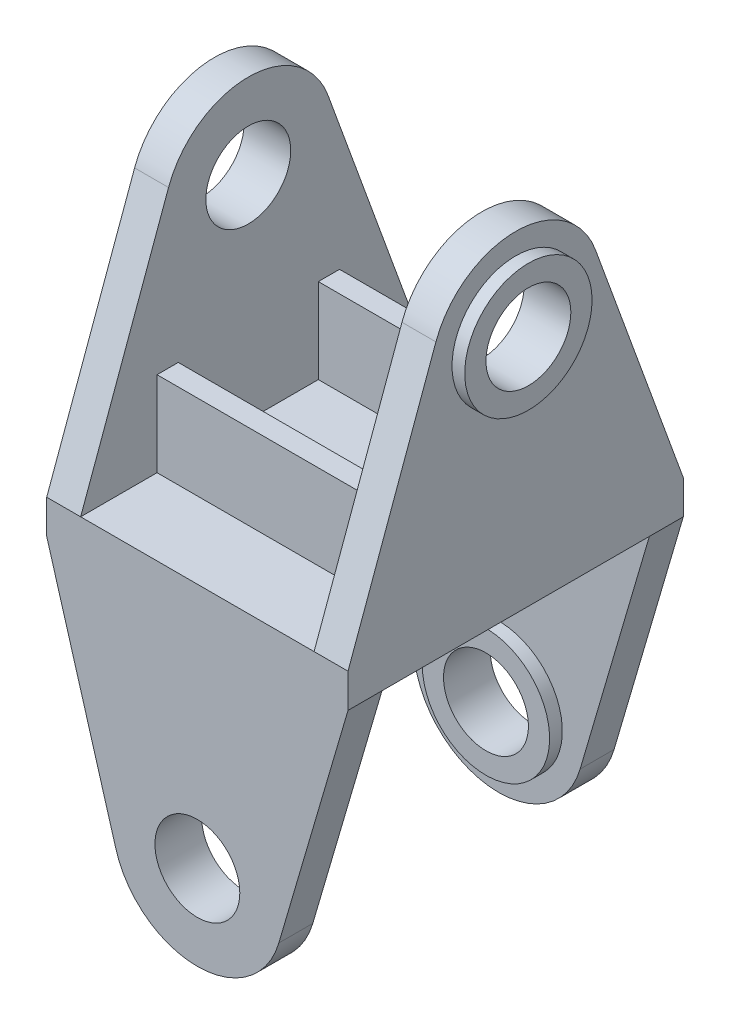
ISO-10303-21;
HEADER;
FILE_DESCRIPTION(('STEP AP214'),'2;1');
FILE_NAME('part.step','',(''),(''),'','','');
FILE_SCHEMA(('AUTOMOTIVE_DESIGN { 1 0 10303 214 1 1 1 1 }'));
ENDSEC;
DATA;
#1=APPLICATION_CONTEXT('core data for automotive mechanical design processes');
#2=APPLICATION_PROTOCOL_DEFINITION('international standard','automotive_design',2000,#1);
#3=PRODUCT_CONTEXT('',#1,'mechanical');
#4=PRODUCT('Part','Part','',(#3));
#5=PRODUCT_RELATED_PRODUCT_CATEGORY('part','',(#4));
#6=PRODUCT_DEFINITION_FORMATION('','',#4);
#7=PRODUCT_DEFINITION_CONTEXT('part definition',#1,'design');
#8=PRODUCT_DEFINITION('design','',#6,#7);
#9=PRODUCT_DEFINITION_SHAPE('','',#8);
#10=(LENGTH_UNIT() NAMED_UNIT(*) SI_UNIT(.MILLI.,.METRE.));
#11=(NAMED_UNIT(*) PLANE_ANGLE_UNIT() SI_UNIT($,.RADIAN.));
#12=(NAMED_UNIT(*) SI_UNIT($,.STERADIAN.) SOLID_ANGLE_UNIT());
#13=UNCERTAINTY_MEASURE_WITH_UNIT(LENGTH_MEASURE(1.E-05),#10,'distance_accuracy_value','');
#14=(GEOMETRIC_REPRESENTATION_CONTEXT(3) GLOBAL_UNCERTAINTY_ASSIGNED_CONTEXT((#13)) GLOBAL_UNIT_ASSIGNED_CONTEXT((#10,
#11,#12)) REPRESENTATION_CONTEXT('',''));
#15=CARTESIAN_POINT('',(0.,0.,0.));
#16=DIRECTION('',(0.,0.,1.));
#17=DIRECTION('',(1.,0.,0.));
#18=AXIS2_PLACEMENT_3D('',#15,#16,#17);
#19=CARTESIAN_POINT('',(-8.,0.,0.));
#20=DIRECTION('',(1.,0.,0.));
#21=DIRECTION('',(0.,0.,-1.));
#22=AXIS2_PLACEMENT_3D('',#19,#20,#21);
#23=PLANE('',#22);
#24=CARTESIAN_POINT('',(-8.,0.,0.));
#25=DIRECTION('',(1.,0.,0.));
#26=DIRECTION('',(0.,0.,-1.));
#27=AXIS2_PLACEMENT_3D('',#24,#25,#26);
#28=CIRCLE('',#27,10.);
#29=CARTESIAN_POINT('',(-8.,0.,-10.));
#30=VERTEX_POINT('',#29);
#31=EDGE_CURVE('E477',#30,#30,#28,.T.);
#32=ORIENTED_EDGE('',*,*,#31,.T.);
#33=EDGE_LOOP('',(#32));
#34=FACE_BOUND('',#33,.T.);
#35=DIRECTION('',(0.,-1.,0.));
#36=VECTOR('',#35,1.);
#37=CARTESIAN_POINT('',(-8.,-30.,21.5));
#38=LINE('',#37,#36);
#39=CARTESIAN_POINT('',(-8.,-30.,21.5));
#40=VERTEX_POINT('',#39);
#41=CARTESIAN_POINT('',(-8.,-50.,21.5));
#42=VERTEX_POINT('',#41);
#43=EDGE_CURVE('E212',#40,#42,#38,.T.);
#44=ORIENTED_EDGE('',*,*,#43,.T.);
#45=DIRECTION('',(0.,0.,1.));
#46=VECTOR('',#45,1.);
#47=CARTESIAN_POINT('',(-8.,-50.,0.));
#48=LINE('',#47,#46);
#49=CARTESIAN_POINT('',(-8.,-50.,39.5));
#50=VERTEX_POINT('',#49);
#51=EDGE_CURVE('E473',#42,#50,#48,.T.);
#52=ORIENTED_EDGE('',*,*,#51,.T.);
#53=DIRECTION('',(0.,0.939597315436242,-0.342281879194631));
#54=VECTOR('',#53,1.);
#55=CARTESIAN_POINT('',(-8.,6.84563758389262,18.7919463087248));
#56=LINE('',#55,#54);
#57=CARTESIAN_POINT('',(-8.,6.84563758389262,18.7919463087248));
#58=VERTEX_POINT('',#57);
#59=EDGE_CURVE('E499',#50,#58,#56,.T.);
#60=ORIENTED_EDGE('',*,*,#59,.T.);
#61=CARTESIAN_POINT('',(-8.,0.,0.));
#62=DIRECTION('',(1.,0.,0.));
#63=DIRECTION('',(0.,0.,-1.));
#64=AXIS2_PLACEMENT_3D('',#61,#62,#63);
#65=CIRCLE('',#64,20.);
#66=CARTESIAN_POINT('',(-8.,6.84563758389262,-18.7919463087248));
#67=VERTEX_POINT('',#66);
#68=EDGE_CURVE('E494',#67,#58,#65,.T.);
#69=ORIENTED_EDGE('',*,*,#68,.F.);
#70=DIRECTION('',(0.,0.939597315436242,0.342281879194631));
#71=VECTOR('',#70,1.);
#72=CARTESIAN_POINT('',(-8.,6.84563758389262,-18.7919463087248));
#73=LINE('',#72,#71);
#74=CARTESIAN_POINT('',(-8.,-50.,-39.5));
#75=VERTEX_POINT('',#74);
#76=EDGE_CURVE('E490',#75,#67,#73,.T.);
#77=ORIENTED_EDGE('',*,*,#76,.F.);
#78=DIRECTION('',(0.,0.,1.));
#79=VECTOR('',#78,1.);
#80=CARTESIAN_POINT('',(-8.,-50.,0.));
#81=LINE('',#80,#79);
#82=CARTESIAN_POINT('',(-8.,-50.,-21.5));
#83=VERTEX_POINT('',#82);
#84=EDGE_CURVE('E349',#75,#83,#81,.T.);
#85=ORIENTED_EDGE('',*,*,#84,.T.);
#86=DIRECTION('',(0.,1.,0.));
#87=VECTOR('',#86,1.);
#88=CARTESIAN_POINT('',(-8.,-58.,-21.5));
#89=LINE('',#88,#87);
#90=CARTESIAN_POINT('',(-8.,-30.,-21.5));
#91=VERTEX_POINT('',#90);
#92=EDGE_CURVE('E66',#83,#91,#89,.T.);
#93=ORIENTED_EDGE('',*,*,#92,.T.);
#94=DIRECTION('',(0.,0.,1.));
#95=VECTOR('',#94,1.);
#96=CARTESIAN_POINT('',(-8.,-30.,0.));
#97=LINE('',#96,#95);
#98=CARTESIAN_POINT('',(-8.,-30.,-16.5));
#99=VERTEX_POINT('',#98);
#100=EDGE_CURVE('E61',#91,#99,#97,.T.);
#101=ORIENTED_EDGE('',*,*,#100,.T.);
#102=DIRECTION('',(0.,1.,0.));
#103=VECTOR('',#102,1.);
#104=CARTESIAN_POINT('',(-8.,-58.,-16.5));
#105=LINE('',#104,#103);
#106=CARTESIAN_POINT('',(-8.,-50.,-16.5));
#107=VERTEX_POINT('',#106);
#108=EDGE_CURVE('E262',#107,#99,#105,.T.);
#109=ORIENTED_EDGE('',*,*,#108,.F.);
#110=DIRECTION('',(0.,0.,1.));
#111=VECTOR('',#110,1.);
#112=CARTESIAN_POINT('',(-8.,-50.,0.));
#113=LINE('',#112,#111);
#114=CARTESIAN_POINT('',(-8.,-50.,16.5));
#115=VERTEX_POINT('',#114);
#116=EDGE_CURVE('E282',#107,#115,#113,.T.);
#117=ORIENTED_EDGE('',*,*,#116,.T.);
#118=DIRECTION('',(0.,-1.,0.));
#119=VECTOR('',#118,1.);
#120=CARTESIAN_POINT('',(-8.,-30.,16.5));
#121=LINE('',#120,#119);
#122=CARTESIAN_POINT('',(-8.,-30.,16.5));
#123=VERTEX_POINT('',#122);
#124=EDGE_CURVE('E241',#123,#115,#121,.T.);
#125=ORIENTED_EDGE('',*,*,#124,.F.);
#126=DIRECTION('',(0.,0.,1.));
#127=VECTOR('',#126,1.);
#128=CARTESIAN_POINT('',(-8.,-30.,0.));
#129=LINE('',#128,#127);
#130=EDGE_CURVE('E216',#123,#40,#129,.T.);
#131=ORIENTED_EDGE('',*,*,#130,.T.);
#132=EDGE_LOOP('',(#44,#52,#60,#69,#77,#85,#93,#101,#109,#117,#125,#131));
#133=FACE_BOUND('',#132,.T.);
#134=ADVANCED_FACE('F45',(#34,#133),#23,.F.);
#135=CARTESIAN_POINT('',(-63.,0.,0.));
#136=DIRECTION('',(1.,0.,0.));
#137=DIRECTION('',(0.,0.,-1.));
#138=AXIS2_PLACEMENT_3D('',#135,#136,#137);
#139=PLANE('',#138);
#140=CARTESIAN_POINT('',(-63.,0.,0.));
#141=DIRECTION('',(1.,0.,0.));
#142=DIRECTION('',(0.,0.,-1.));
#143=AXIS2_PLACEMENT_3D('',#140,#141,#142);
#144=CIRCLE('',#143,10.);
#145=CARTESIAN_POINT('',(-63.,0.,-10.));
#146=VERTEX_POINT('',#145);
#147=EDGE_CURVE('E376',#146,#146,#144,.T.);
#148=ORIENTED_EDGE('',*,*,#147,.F.);
#149=EDGE_LOOP('',(#148));
#150=FACE_BOUND('',#149,.T.);
#151=DIRECTION('',(0.,0.,-1.));
#152=VECTOR('',#151,1.);
#153=CARTESIAN_POINT('',(-63.,-50.,31.5));
#154=LINE('',#153,#152);
#155=CARTESIAN_POINT('',(-63.,-50.,39.5));
#156=VERTEX_POINT('',#155);
#157=CARTESIAN_POINT('',(-63.,-50.,21.5));
#158=VERTEX_POINT('',#157);
#159=EDGE_CURVE('E231',#156,#158,#154,.T.);
#160=ORIENTED_EDGE('',*,*,#159,.T.);
#161=DIRECTION('',(0.,-1.,0.));
#162=VECTOR('',#161,1.);
#163=CARTESIAN_POINT('',(-63.,-30.,21.5));
#164=LINE('',#163,#162);
#165=CARTESIAN_POINT('',(-63.,-30.,21.5));
#166=VERTEX_POINT('',#165);
#167=EDGE_CURVE('E209',#166,#158,#164,.T.);
#168=ORIENTED_EDGE('',*,*,#167,.F.);
#169=DIRECTION('',(0.,0.,1.));
#170=VECTOR('',#169,1.);
#171=CARTESIAN_POINT('',(-63.,-30.,0.));
#172=LINE('',#171,#170);
#173=CARTESIAN_POINT('',(-63.,-30.,16.5));
#174=VERTEX_POINT('',#173);
#175=EDGE_CURVE('E217',#174,#166,#172,.T.);
#176=ORIENTED_EDGE('',*,*,#175,.F.);
#177=DIRECTION('',(0.,-1.,0.));
#178=VECTOR('',#177,1.);
#179=CARTESIAN_POINT('',(-63.,-30.,16.5));
#180=LINE('',#179,#178);
#181=CARTESIAN_POINT('',(-63.,-50.,16.5));
#182=VERTEX_POINT('',#181);
#183=EDGE_CURVE('E1157',#174,#182,#180,.T.);
#184=ORIENTED_EDGE('',*,*,#183,.T.);
#185=DIRECTION('',(0.,0.,1.));
#186=VECTOR('',#185,1.);
#187=CARTESIAN_POINT('',(-63.,-50.,0.));
#188=LINE('',#187,#186);
#189=CARTESIAN_POINT('',(-63.,-50.,-16.5));
#190=VERTEX_POINT('',#189);
#191=EDGE_CURVE('E274',#190,#182,#188,.T.);
#192=ORIENTED_EDGE('',*,*,#191,.F.);
#193=DIRECTION('',(0.,1.,0.));
#194=VECTOR('',#193,1.);
#195=CARTESIAN_POINT('',(-63.,-58.,-16.5));
#196=LINE('',#195,#194);
#197=CARTESIAN_POINT('',(-63.,-30.,-16.5));
#198=VERTEX_POINT('',#197);
#199=EDGE_CURVE('E254',#190,#198,#196,.T.);
#200=ORIENTED_EDGE('',*,*,#199,.T.);
#201=DIRECTION('',(0.,0.,1.));
#202=VECTOR('',#201,1.);
#203=CARTESIAN_POINT('',(-63.,-30.,0.));
#204=LINE('',#203,#202);
#205=CARTESIAN_POINT('',(-63.,-30.,-21.5));
#206=VERTEX_POINT('',#205);
#207=EDGE_CURVE('E234',#206,#198,#204,.T.);
#208=ORIENTED_EDGE('',*,*,#207,.F.);
#209=DIRECTION('',(0.,1.,0.));
#210=VECTOR('',#209,1.);
#211=CARTESIAN_POINT('',(-63.,-58.,-21.5));
#212=LINE('',#211,#210);
#213=CARTESIAN_POINT('',(-63.,-50.,-21.5));
#214=VERTEX_POINT('',#213);
#215=EDGE_CURVE('E255',#214,#206,#212,.T.);
#216=ORIENTED_EDGE('',*,*,#215,.F.);
#217=DIRECTION('',(0.,0.,1.));
#218=VECTOR('',#217,1.);
#219=CARTESIAN_POINT('',(-63.,-50.,0.));
#220=LINE('',#219,#218);
#221=CARTESIAN_POINT('',(-63.,-50.,-39.5));
#222=VERTEX_POINT('',#221);
#223=EDGE_CURVE('E11',#222,#214,#220,.T.);
#224=ORIENTED_EDGE('',*,*,#223,.F.);
#225=DIRECTION('',(0.,0.939597315436242,0.342281879194631));
#226=VECTOR('',#225,1.);
#227=CARTESIAN_POINT('',(-63.,6.84563758389262,-18.7919463087248));
#228=LINE('',#227,#226);
#229=CARTESIAN_POINT('',(-63.,6.84563758389262,-18.7919463087248));
#230=VERTEX_POINT('',#229);
#231=EDGE_CURVE('E384',#222,#230,#228,.T.);
#232=ORIENTED_EDGE('',*,*,#231,.T.);
#233=CARTESIAN_POINT('',(-63.,0.,0.));
#234=DIRECTION('',(1.,0.,0.));
#235=DIRECTION('',(0.,0.,-1.));
#236=AXIS2_PLACEMENT_3D('',#233,#234,#235);
#237=CIRCLE('',#236,20.);
#238=CARTESIAN_POINT('',(-63.,6.84563758389262,18.7919463087248));
#239=VERTEX_POINT('',#238);
#240=EDGE_CURVE('E409',#230,#239,#237,.T.);
#241=ORIENTED_EDGE('',*,*,#240,.T.);
#242=DIRECTION('',(0.,0.939597315436242,-0.342281879194631));
#243=VECTOR('',#242,1.);
#244=CARTESIAN_POINT('',(-63.,6.84563758389262,18.7919463087248));
#245=LINE('',#244,#243);
#246=EDGE_CURVE('E390',#156,#239,#245,.T.);
#247=ORIENTED_EDGE('',*,*,#246,.F.);
#248=EDGE_LOOP('',(#160,#168,#176,#184,#192,#200,#208,#216,#224,#232,#241,#247));
#249=FACE_BOUND('',#248,.T.);
#250=ADVANCED_FACE('F228',(#150,#249),#139,.T.);
#251=CARTESIAN_POINT('',(0.,0.,-31.5));
#252=DIRECTION('',(0.,0.,-1.));
#253=DIRECTION('',(-1.,0.,0.));
#254=AXIS2_PLACEMENT_3D('',#251,#252,#253);
#255=PLANE('',#254);
#256=CARTESIAN_POINT('',(-35.5,-108.,-31.5));
#257=DIRECTION('',(0.,0.,-1.));
#258=DIRECTION('',(-1.,0.,0.));
#259=AXIS2_PLACEMENT_3D('',#256,#257,#258);
#260=CIRCLE('',#259,15.);
#261=CARTESIAN_POINT('',(-50.5,-108.,-31.5));
#262=VERTEX_POINT('',#261);
#263=EDGE_CURVE('E298',#262,#262,#260,.T.);
#264=ORIENTED_EDGE('',*,*,#263,.T.);
#265=EDGE_LOOP('',(#264));
#266=FACE_BOUND('',#265,.T.);
#267=DIRECTION('',(1.,0.,0.));
#268=VECTOR('',#267,1.);
#269=CARTESIAN_POINT('',(-8.,-58.,-31.5));
#270=LINE('',#269,#268);
#271=CARTESIAN_POINT('',(-71.,-58.,-31.5));
#272=VERTEX_POINT('',#271);
#273=CARTESIAN_POINT('',(0.,-58.,-31.5));
#274=VERTEX_POINT('',#273);
#275=EDGE_CURVE('E336',#272,#274,#270,.T.);
#276=ORIENTED_EDGE('',*,*,#275,.F.);
#277=DIRECTION('',(0.281324925386063,-0.959612570966286,0.));
#278=VECTOR('',#277,1.);
#279=CARTESIAN_POINT('',(-81.0386465570572,-23.7577037711114,-31.5));
#280=LINE('',#279,#278);
#281=CARTESIAN_POINT('',(-54.6922514193257,-113.626498507721,-31.5));
#282=VERTEX_POINT('',#281);
#283=EDGE_CURVE('E315',#272,#282,#280,.T.);
#284=ORIENTED_EDGE('',*,*,#283,.T.);
#285=CARTESIAN_POINT('',(-35.5,-108.,-31.5));
#286=DIRECTION('',(0.,0.,-1.));
#287=DIRECTION('',(-1.,0.,0.));
#288=AXIS2_PLACEMENT_3D('',#285,#286,#287);
#289=CIRCLE('',#288,20.);
#290=CARTESIAN_POINT('',(-16.3077485806743,-113.626498507721,-31.5));
#291=VERTEX_POINT('',#290);
#292=EDGE_CURVE('E310',#291,#282,#289,.T.);
#293=ORIENTED_EDGE('',*,*,#292,.F.);
#294=DIRECTION('',(-0.281324925386063,-0.959612570966286,0.));
#295=VECTOR('',#294,1.);
#296=CARTESIAN_POINT('',(15.6578502257439,-4.5903353913215,-31.5));
#297=LINE('',#296,#295);
#298=EDGE_CURVE('E306',#274,#291,#297,.T.);
#299=ORIENTED_EDGE('',*,*,#298,.F.);
#300=EDGE_LOOP('',(#276,#284,#293,#299));
#301=FACE_BOUND('',#300,.T.);
#302=ADVANCED_FACE('F579',(#266,#301),#255,.F.);
#303=CARTESIAN_POINT('',(0.,0.,31.5));
#304=DIRECTION('',(0.,0.,1.));
#305=DIRECTION('',(1.,0.,0.));
#306=AXIS2_PLACEMENT_3D('',#303,#304,#305);
#307=PLANE('',#306);
#308=CARTESIAN_POINT('',(-35.5,-108.,31.5));
#309=DIRECTION('',(0.,0.,1.));
#310=DIRECTION('',(1.,0.,0.));
#311=AXIS2_PLACEMENT_3D('',#308,#309,#310);
#312=CIRCLE('',#311,15.);
#313=CARTESIAN_POINT('',(-20.5,-108.,31.5));
#314=VERTEX_POINT('',#313);
#315=EDGE_CURVE('E361',#314,#314,#312,.T.);
#316=ORIENTED_EDGE('',*,*,#315,.T.);
#317=EDGE_LOOP('',(#316));
#318=FACE_BOUND('',#317,.T.);
#319=DIRECTION('',(0.281324925386063,-0.959612570966286,0.));
#320=VECTOR('',#319,1.);
#321=CARTESIAN_POINT('',(-81.0386465570572,-23.7577037711114,31.5));
#322=LINE('',#321,#320);
#323=CARTESIAN_POINT('',(-71.,-58.,31.5));
#324=VERTEX_POINT('',#323);
#325=CARTESIAN_POINT('',(-54.6922514193257,-113.626498507721,31.5));
#326=VERTEX_POINT('',#325);
#327=EDGE_CURVE('E431',#324,#326,#322,.T.);
#328=ORIENTED_EDGE('',*,*,#327,.F.);
#329=DIRECTION('',(-1.,0.,0.));
#330=VECTOR('',#329,1.);
#331=CARTESIAN_POINT('',(-8.,-58.,31.5));
#332=LINE('',#331,#330);
#333=CARTESIAN_POINT('',(0.,-58.,31.5));
#334=VERTEX_POINT('',#333);
#335=EDGE_CURVE('E465',#334,#324,#332,.T.);
#336=ORIENTED_EDGE('',*,*,#335,.F.);
#337=DIRECTION('',(-0.281324925386063,-0.959612570966286,0.));
#338=VECTOR('',#337,1.);
#339=CARTESIAN_POINT('',(15.6578502257439,-4.5903353913215,31.5));
#340=LINE('',#339,#338);
#341=CARTESIAN_POINT('',(-16.3077485806743,-113.626498507721,31.5));
#342=VERTEX_POINT('',#341);
#343=EDGE_CURVE('E440',#334,#342,#340,.T.);
#344=ORIENTED_EDGE('',*,*,#343,.T.);
#345=CARTESIAN_POINT('',(-35.5,-108.,31.5));
#346=DIRECTION('',(0.,0.,1.));
#347=DIRECTION('',(1.,0.,0.));
#348=AXIS2_PLACEMENT_3D('',#345,#346,#347);
#349=CIRCLE('',#348,20.);
#350=EDGE_CURVE('E435',#326,#342,#349,.T.);
#351=ORIENTED_EDGE('',*,*,#350,.F.);
#352=EDGE_LOOP('',(#328,#336,#344,#351));
#353=FACE_BOUND('',#352,.T.);
#354=ADVANCED_FACE('F835',(#318,#353),#307,.F.);
#355=CARTESIAN_POINT('',(-71.,-58.,0.));
#356=DIRECTION('',(0.,-1.,0.));
#357=DIRECTION('',(0.,0.,-1.));
#358=AXIS2_PLACEMENT_3D('',#355,#356,#357);
#359=PLANE('',#358);
#360=DIRECTION('',(0.,0.,-1.));
#361=VECTOR('',#360,1.);
#362=CARTESIAN_POINT('',(-71.,-58.,0.));
#363=LINE('',#362,#361);
#364=EDGE_CURVE('E397',#324,#272,#363,.T.);
#365=ORIENTED_EDGE('',*,*,#364,.T.);
#366=ORIENTED_EDGE('',*,*,#275,.T.);
#367=DIRECTION('',(0.,0.,-1.));
#368=VECTOR('',#367,1.);
#369=CARTESIAN_POINT('',(0.,-58.,0.));
#370=LINE('',#369,#368);
#371=EDGE_CURVE('E522',#334,#274,#370,.T.);
#372=ORIENTED_EDGE('',*,*,#371,.F.);
#373=ORIENTED_EDGE('',*,*,#335,.T.);
#374=EDGE_LOOP('',(#365,#366,#372,#373));
#375=FACE_BOUND('',#374,.T.);
#376=ADVANCED_FACE('F574',(#375),#359,.T.);
#377=CARTESIAN_POINT('',(-8.,6.84563758389262,-18.7919463087248));
#378=DIRECTION('',(0.,0.342281879194631,-0.939597315436242));
#379=DIRECTION('',(0.,0.939597315436242,0.342281879194631));
#380=AXIS2_PLACEMENT_3D('',#377,#378,#379);
#381=PLANE('',#380);
#382=DIRECTION('',(0.,0.939597315436242,0.342281879194631));
#383=VECTOR('',#382,1.);
#384=CARTESIAN_POINT('',(0.,6.84563758389262,-18.7919463087248));
#385=LINE('',#384,#383);
#386=CARTESIAN_POINT('',(0.,-50.,-39.5));
#387=VERTEX_POINT('',#386);
#388=CARTESIAN_POINT('',(0.,6.84563758389262,-18.7919463087248));
#389=VERTEX_POINT('',#388);
#390=EDGE_CURVE('E506',#387,#389,#385,.T.);
#391=ORIENTED_EDGE('',*,*,#390,.F.);
#392=DIRECTION('',(1.,0.,0.));
#393=VECTOR('',#392,1.);
#394=CARTESIAN_POINT('',(-8.,-50.,-39.5));
#395=LINE('',#394,#393);
#396=EDGE_CURVE('E54',#75,#387,#395,.T.);
#397=ORIENTED_EDGE('',*,*,#396,.F.);
#398=ORIENTED_EDGE('',*,*,#76,.T.);
#399=DIRECTION('',(1.,0.,0.));
#400=VECTOR('',#399,1.);
#401=CARTESIAN_POINT('',(-8.,6.84563758389262,-18.7919463087248));
#402=LINE('',#401,#400);
#403=EDGE_CURVE('E502',#67,#389,#402,.T.);
#404=ORIENTED_EDGE('',*,*,#403,.T.);
#405=EDGE_LOOP('',(#391,#397,#398,#404));
#406=FACE_BOUND('',#405,.T.);
#407=ADVANCED_FACE('F47',(#406),#381,.T.);
#408=CARTESIAN_POINT('',(-8.,0.,-39.5));
#409=DIRECTION('',(0.,0.,1.));
#410=DIRECTION('',(1.,0.,0.));
#411=AXIS2_PLACEMENT_3D('',#408,#409,#410);
#412=PLANE('',#411);
#413=DIRECTION('',(1.,0.,0.));
#414=VECTOR('',#413,1.);
#415=CARTESIAN_POINT('',(-71.,-50.,-39.5));
#416=LINE('',#415,#414);
#417=CARTESIAN_POINT('',(-71.,-50.,-39.5));
#418=VERTEX_POINT('',#417);
#419=EDGE_CURVE('E416',#418,#222,#416,.T.);
#420=ORIENTED_EDGE('',*,*,#419,.T.);
#421=DIRECTION('',(1.,0.,0.));
#422=VECTOR('',#421,1.);
#423=CARTESIAN_POINT('',(0.,-50.,-39.5));
#424=LINE('',#423,#422);
#425=EDGE_CURVE('E305',#222,#75,#424,.T.);
#426=ORIENTED_EDGE('',*,*,#425,.T.);
#427=ORIENTED_EDGE('',*,*,#396,.T.);
#428=DIRECTION('',(0.,-1.,0.));
#429=VECTOR('',#428,1.);
#430=CARTESIAN_POINT('',(0.,0.,-39.5));
#431=LINE('',#430,#429);
#432=CARTESIAN_POINT('',(0.,-58.,-39.5));
#433=VERTEX_POINT('',#432);
#434=EDGE_CURVE('E495',#387,#433,#431,.T.);
#435=ORIENTED_EDGE('',*,*,#434,.T.);
#436=DIRECTION('',(-0.281324925386063,-0.959612570966286,0.));
#437=VECTOR('',#436,1.);
#438=CARTESIAN_POINT('',(15.6578502257439,-4.5903353913215,-39.5));
#439=LINE('',#438,#437);
#440=CARTESIAN_POINT('',(-16.3077485806743,-113.626498507721,-39.5));
#441=VERTEX_POINT('',#440);
#442=EDGE_CURVE('E322',#433,#441,#439,.T.);
#443=ORIENTED_EDGE('',*,*,#442,.T.);
#444=CARTESIAN_POINT('',(-35.5,-108.,-39.5));
#445=DIRECTION('',(0.,0.,-1.));
#446=DIRECTION('',(-1.,0.,0.));
#447=AXIS2_PLACEMENT_3D('',#444,#445,#446);
#448=CIRCLE('',#447,20.);
#449=CARTESIAN_POINT('',(-54.6922514193257,-113.626498507721,-39.5));
#450=VERTEX_POINT('',#449);
#451=EDGE_CURVE('E326',#441,#450,#448,.T.);
#452=ORIENTED_EDGE('',*,*,#451,.T.);
#453=DIRECTION('',(0.281324925386063,-0.959612570966286,0.));
#454=VECTOR('',#453,1.);
#455=CARTESIAN_POINT('',(-81.0386465570572,-23.7577037711114,-39.5));
#456=LINE('',#455,#454);
#457=CARTESIAN_POINT('',(-71.,-58.,-39.5));
#458=VERTEX_POINT('',#457);
#459=EDGE_CURVE('E311',#458,#450,#456,.T.);
#460=ORIENTED_EDGE('',*,*,#459,.F.);
#461=DIRECTION('',(0.,-1.,0.));
#462=VECTOR('',#461,1.);
#463=CARTESIAN_POINT('',(-71.,0.,-39.5));
#464=LINE('',#463,#462);
#465=EDGE_CURVE('E401',#418,#458,#464,.T.);
#466=ORIENTED_EDGE('',*,*,#465,.F.);
#467=EDGE_LOOP('',(#420,#426,#427,#435,#443,#452,#460,#466));
#468=FACE_BOUND('',#467,.T.);
#469=CARTESIAN_POINT('',(-35.5,-108.,-39.5));
#470=DIRECTION('',(0.,0.,-1.));
#471=DIRECTION('',(-1.,0.,0.));
#472=AXIS2_PLACEMENT_3D('',#469,#470,#471);
#473=CIRCLE('',#472,10.);
#474=CARTESIAN_POINT('',(-45.5,-108.,-39.5));
#475=VERTEX_POINT('',#474);
#476=EDGE_CURVE('E289',#475,#475,#473,.T.);
#477=ORIENTED_EDGE('',*,*,#476,.F.);
#478=EDGE_LOOP('',(#477));
#479=FACE_BOUND('',#478,.T.);
#480=ADVANCED_FACE('F554',(#468,#479),#412,.F.);
#481=CARTESIAN_POINT('',(-8.,0.,39.5));
#482=DIRECTION('',(0.,0.,1.));
#483=DIRECTION('',(1.,0.,0.));
#484=AXIS2_PLACEMENT_3D('',#481,#482,#483);
#485=PLANE('',#484);
#486=DIRECTION('',(1.,0.,0.));
#487=VECTOR('',#486,1.);
#488=CARTESIAN_POINT('',(-8.,-50.,39.5));
#489=LINE('',#488,#487);
#490=CARTESIAN_POINT('',(0.,-50.,39.5));
#491=VERTEX_POINT('',#490);
#492=EDGE_CURVE('E532',#50,#491,#489,.T.);
#493=ORIENTED_EDGE('',*,*,#492,.F.);
#494=DIRECTION('',(-1.,0.,0.));
#495=VECTOR('',#494,1.);
#496=CARTESIAN_POINT('',(0.,-50.,39.5));
#497=LINE('',#496,#495);
#498=EDGE_CURVE('E430',#50,#156,#497,.T.);
#499=ORIENTED_EDGE('',*,*,#498,.T.);
#500=DIRECTION('',(1.,0.,0.));
#501=VECTOR('',#500,1.);
#502=CARTESIAN_POINT('',(-71.,-50.,39.5));
#503=LINE('',#502,#501);
#504=CARTESIAN_POINT('',(-71.,-50.,39.5));
#505=VERTEX_POINT('',#504);
#506=EDGE_CURVE('E420',#505,#156,#503,.T.);
#507=ORIENTED_EDGE('',*,*,#506,.F.);
#508=DIRECTION('',(0.,-1.,0.));
#509=VECTOR('',#508,1.);
#510=CARTESIAN_POINT('',(-71.,0.,39.5));
#511=LINE('',#510,#509);
#512=CARTESIAN_POINT('',(-71.,-58.,39.5));
#513=VERTEX_POINT('',#512);
#514=EDGE_CURVE('E447',#505,#513,#511,.T.);
#515=ORIENTED_EDGE('',*,*,#514,.T.);
#516=DIRECTION('',(0.281324925386063,-0.959612570966286,0.));
#517=VECTOR('',#516,1.);
#518=CARTESIAN_POINT('',(-81.0386465570572,-23.7577037711114,39.5));
#519=LINE('',#518,#517);
#520=CARTESIAN_POINT('',(-54.6922514193257,-113.626498507721,39.5));
#521=VERTEX_POINT('',#520);
#522=EDGE_CURVE('E451',#513,#521,#519,.T.);
#523=ORIENTED_EDGE('',*,*,#522,.T.);
#524=CARTESIAN_POINT('',(-35.5,-108.,39.5));
#525=DIRECTION('',(0.,0.,1.));
#526=DIRECTION('',(1.,0.,0.));
#527=AXIS2_PLACEMENT_3D('',#524,#525,#526);
#528=CIRCLE('',#527,20.);
#529=CARTESIAN_POINT('',(-16.3077485806743,-113.626498507721,39.5));
#530=VERTEX_POINT('',#529);
#531=EDGE_CURVE('E455',#521,#530,#528,.T.);
#532=ORIENTED_EDGE('',*,*,#531,.T.);
#533=DIRECTION('',(-0.281324925386063,-0.959612570966286,0.));
#534=VECTOR('',#533,1.);
#535=CARTESIAN_POINT('',(15.6578502257439,-4.5903353913215,39.5));
#536=LINE('',#535,#534);
#537=CARTESIAN_POINT('',(0.,-58.,39.5));
#538=VERTEX_POINT('',#537);
#539=EDGE_CURVE('E436',#538,#530,#536,.T.);
#540=ORIENTED_EDGE('',*,*,#539,.F.);
#541=DIRECTION('',(0.,-1.,0.));
#542=VECTOR('',#541,1.);
#543=CARTESIAN_POINT('',(0.,0.,39.5));
#544=LINE('',#543,#542);
#545=EDGE_CURVE('E518',#491,#538,#544,.T.);
#546=ORIENTED_EDGE('',*,*,#545,.F.);
#547=EDGE_LOOP('',(#493,#499,#507,#515,#523,#532,#540,#546));
#548=FACE_BOUND('',#547,.T.);
#549=CARTESIAN_POINT('',(-35.5,-108.,39.5));
#550=DIRECTION('',(0.,0.,1.));
#551=DIRECTION('',(1.,0.,0.));
#552=AXIS2_PLACEMENT_3D('',#549,#550,#551);
#553=CIRCLE('',#552,10.);
#554=CARTESIAN_POINT('',(-25.5,-108.,39.5));
#555=VERTEX_POINT('',#554);
#556=EDGE_CURVE('E352',#555,#555,#553,.T.);
#557=ORIENTED_EDGE('',*,*,#556,.F.);
#558=EDGE_LOOP('',(#557));
#559=FACE_BOUND('',#558,.T.);
#560=ADVANCED_FACE('F564',(#548,#559),#485,.T.);
#561=CARTESIAN_POINT('',(-8.,6.84563758389262,18.7919463087248));
#562=DIRECTION('',(0.,-0.342281879194631,-0.939597315436242));
#563=DIRECTION('',(0.,0.939597315436242,-0.342281879194631));
#564=AXIS2_PLACEMENT_3D('',#561,#562,#563);
#565=PLANE('',#564);
#566=DIRECTION('',(0.,0.939597315436242,-0.342281879194631));
#567=VECTOR('',#566,1.);
#568=CARTESIAN_POINT('',(0.,6.84563758389262,18.7919463087248));
#569=LINE('',#568,#567);
#570=CARTESIAN_POINT('',(0.,6.84563758389262,18.7919463087248));
#571=VERTEX_POINT('',#570);
#572=EDGE_CURVE('E514',#491,#571,#569,.T.);
#573=ORIENTED_EDGE('',*,*,#572,.T.);
#574=DIRECTION('',(1.,0.,0.));
#575=VECTOR('',#574,1.);
#576=CARTESIAN_POINT('',(-8.,6.84563758389262,18.7919463087248));
#577=LINE('',#576,#575);
#578=EDGE_CURVE('E535',#58,#571,#577,.T.);
#579=ORIENTED_EDGE('',*,*,#578,.F.);
#580=ORIENTED_EDGE('',*,*,#59,.F.);
#581=ORIENTED_EDGE('',*,*,#492,.T.);
#582=EDGE_LOOP('',(#573,#579,#580,#581));
#583=FACE_BOUND('',#582,.T.);
#584=ADVANCED_FACE('F560',(#583),#565,.F.);
#585=CARTESIAN_POINT('',(-8.,0.,0.));
#586=DIRECTION('',(1.,0.,0.));
#587=DIRECTION('',(0.,0.,-1.));
#588=AXIS2_PLACEMENT_3D('',#585,#586,#587);
#589=CYLINDRICAL_SURFACE('',#588,20.);
#590=CARTESIAN_POINT('',(0.,0.,0.));
#591=DIRECTION('',(1.,0.,0.));
#592=DIRECTION('',(0.,0.,-1.));
#593=AXIS2_PLACEMENT_3D('',#590,#591,#592);
#594=CIRCLE('',#593,20.);
#595=EDGE_CURVE('E510',#389,#571,#594,.T.);
#596=ORIENTED_EDGE('',*,*,#595,.F.);
#597=ORIENTED_EDGE('',*,*,#403,.F.);
#598=ORIENTED_EDGE('',*,*,#68,.T.);
#599=ORIENTED_EDGE('',*,*,#578,.T.);
#600=EDGE_LOOP('',(#596,#597,#598,#599));
#601=FACE_BOUND('',#600,.T.);
#602=ADVANCED_FACE('F545',(#601),#589,.T.);
#603=CARTESIAN_POINT('',(0.,0.,0.));
#604=DIRECTION('',(1.,0.,0.));
#605=DIRECTION('',(0.,0.,-1.));
#606=AXIS2_PLACEMENT_3D('',#603,#604,#605);
#607=PLANE('',#606);
#608=ORIENTED_EDGE('',*,*,#434,.F.);
#609=ORIENTED_EDGE('',*,*,#390,.T.);
#610=ORIENTED_EDGE('',*,*,#595,.T.);
#611=ORIENTED_EDGE('',*,*,#572,.F.);
#612=ORIENTED_EDGE('',*,*,#545,.T.);
#613=EDGE_CURVE('E523',#538,#334,#370,.T.);
#614=ORIENTED_EDGE('',*,*,#613,.T.);
#615=ORIENTED_EDGE('',*,*,#371,.T.);
#616=DIRECTION('',(0.,0.,-1.));
#617=VECTOR('',#616,1.);
#618=CARTESIAN_POINT('',(0.,-58.,-31.5));
#619=LINE('',#618,#617);
#620=EDGE_CURVE('E318',#274,#433,#619,.T.);
#621=ORIENTED_EDGE('',*,*,#620,.T.);
#622=EDGE_LOOP('',(#608,#609,#610,#611,#612,#614,#615,#621));
#623=FACE_BOUND('',#622,.T.);
#624=CARTESIAN_POINT('',(0.,0.,0.));
#625=DIRECTION('',(1.,0.,0.));
#626=DIRECTION('',(0.,0.,-1.));
#627=AXIS2_PLACEMENT_3D('',#624,#625,#626);
#628=CIRCLE('',#627,15.);
#629=CARTESIAN_POINT('',(0.,0.,-15.));
#630=VERTEX_POINT('',#629);
#631=EDGE_CURVE('E489',#630,#630,#628,.T.);
#632=ORIENTED_EDGE('',*,*,#631,.F.);
#633=EDGE_LOOP('',(#632));
#634=FACE_BOUND('',#633,.T.);
#635=ADVANCED_FACE('F550',(#623,#634),#607,.T.);
#636=CARTESIAN_POINT('',(3.,0.,0.));
#637=DIRECTION('',(-1.,0.,0.));
#638=DIRECTION('',(0.,0.,1.));
#639=AXIS2_PLACEMENT_3D('',#636,#637,#638);
#640=CYLINDRICAL_SURFACE('',#639,10.);
#641=CARTESIAN_POINT('',(3.,0.,0.));
#642=DIRECTION('',(1.,0.,0.));
#643=DIRECTION('',(0.,0.,-1.));
#644=AXIS2_PLACEMENT_3D('',#641,#642,#643);
#645=CIRCLE('',#644,10.);
#646=CARTESIAN_POINT('',(3.,0.,-10.));
#647=VERTEX_POINT('',#646);
#648=EDGE_CURVE('E481',#647,#647,#645,.T.);
#649=ORIENTED_EDGE('',*,*,#648,.T.);
#650=EDGE_LOOP('',(#649));
#651=FACE_BOUND('',#650,.T.);
#652=ORIENTED_EDGE('',*,*,#31,.F.);
#653=EDGE_LOOP('',(#652));
#654=FACE_BOUND('',#653,.T.);
#655=ADVANCED_FACE('F621',(#651,#654),#640,.F.);
#656=CARTESIAN_POINT('',(3.,0.,0.));
#657=DIRECTION('',(-1.,0.,0.));
#658=DIRECTION('',(0.,0.,1.));
#659=AXIS2_PLACEMENT_3D('',#656,#657,#658);
#660=CYLINDRICAL_SURFACE('',#659,15.);
#661=ORIENTED_EDGE('',*,*,#631,.T.);
#662=EDGE_LOOP('',(#661));
#663=FACE_BOUND('',#662,.T.);
#664=CARTESIAN_POINT('',(3.,0.,0.));
#665=DIRECTION('',(1.,0.,0.));
#666=DIRECTION('',(0.,0.,-1.));
#667=AXIS2_PLACEMENT_3D('',#664,#665,#666);
#668=CIRCLE('',#667,15.);
#669=CARTESIAN_POINT('',(3.,0.,-15.));
#670=VERTEX_POINT('',#669);
#671=EDGE_CURVE('E485',#670,#670,#668,.T.);
#672=ORIENTED_EDGE('',*,*,#671,.F.);
#673=EDGE_LOOP('',(#672));
#674=FACE_BOUND('',#673,.T.);
#675=ADVANCED_FACE('F647',(#663,#674),#660,.T.);
#676=CARTESIAN_POINT('',(3.,0.,0.));
#677=DIRECTION('',(1.,0.,0.));
#678=DIRECTION('',(0.,0.,-1.));
#679=AXIS2_PLACEMENT_3D('',#676,#677,#678);
#680=PLANE('',#679);
#681=ORIENTED_EDGE('',*,*,#648,.F.);
#682=EDGE_LOOP('',(#681));
#683=FACE_BOUND('',#682,.T.);
#684=ORIENTED_EDGE('',*,*,#671,.T.);
#685=EDGE_LOOP('',(#684));
#686=FACE_BOUND('',#685,.T.);
#687=ADVANCED_FACE('F654',(#683,#686),#680,.T.);
#688=CARTESIAN_POINT('',(0.,-50.,31.5));
#689=DIRECTION('',(0.,1.,0.));
#690=DIRECTION('',(0.,0.,1.));
#691=AXIS2_PLACEMENT_3D('',#688,#689,#690);
#692=PLANE('',#691);
#693=ORIENTED_EDGE('',*,*,#159,.F.);
#694=ORIENTED_EDGE('',*,*,#498,.F.);
#695=ORIENTED_EDGE('',*,*,#51,.F.);
#696=DIRECTION('',(1.,0.,0.));
#697=VECTOR('',#696,1.);
#698=CARTESIAN_POINT('',(0.,-50.,21.5));
#699=LINE('',#698,#697);
#700=EDGE_CURVE('E286',#158,#42,#699,.T.);
#701=ORIENTED_EDGE('',*,*,#700,.F.);
#702=EDGE_LOOP('',(#693,#694,#695,#701));
#703=FACE_BOUND('',#702,.T.);
#704=ADVANCED_FACE('F661',(#703),#692,.T.);
#705=CARTESIAN_POINT('',(15.6578502257439,-4.5903353913215,31.5));
#706=DIRECTION('',(-0.959612570966286,0.281324925386063,0.));
#707=DIRECTION('',(-0.281324925386063,-0.959612570966286,0.));
#708=AXIS2_PLACEMENT_3D('',#705,#706,#707);
#709=PLANE('',#708);
#710=ORIENTED_EDGE('',*,*,#539,.T.);
#711=DIRECTION('',(0.,0.,1.));
#712=VECTOR('',#711,1.);
#713=CARTESIAN_POINT('',(-16.3077485806743,-113.626498507721,31.5));
#714=LINE('',#713,#712);
#715=EDGE_CURVE('E462',#342,#530,#714,.T.);
#716=ORIENTED_EDGE('',*,*,#715,.F.);
#717=ORIENTED_EDGE('',*,*,#343,.F.);
#718=ORIENTED_EDGE('',*,*,#613,.F.);
#719=EDGE_LOOP('',(#710,#716,#717,#718));
#720=FACE_BOUND('',#719,.T.);
#721=ADVANCED_FACE('F569',(#720),#709,.F.);
#722=CARTESIAN_POINT('',(-35.5,-108.,31.5));
#723=DIRECTION('',(0.,0.,1.));
#724=DIRECTION('',(1.,0.,0.));
#725=AXIS2_PLACEMENT_3D('',#722,#723,#724);
#726=CYLINDRICAL_SURFACE('',#725,20.);
#727=ORIENTED_EDGE('',*,*,#531,.F.);
#728=DIRECTION('',(0.,0.,1.));
#729=VECTOR('',#728,1.);
#730=CARTESIAN_POINT('',(-54.6922514193257,-113.626498507721,31.5));
#731=LINE('',#730,#729);
#732=EDGE_CURVE('E466',#326,#521,#731,.T.);
#733=ORIENTED_EDGE('',*,*,#732,.F.);
#734=ORIENTED_EDGE('',*,*,#350,.T.);
#735=ORIENTED_EDGE('',*,*,#715,.T.);
#736=EDGE_LOOP('',(#727,#733,#734,#735));
#737=FACE_BOUND('',#736,.T.);
#738=ADVANCED_FACE('F678',(#737),#726,.T.);
#739=CARTESIAN_POINT('',(-81.0386465570572,-23.7577037711114,31.5));
#740=DIRECTION('',(-0.959612570966286,-0.281324925386063,0.));
#741=DIRECTION('',(0.281324925386063,-0.959612570966286,0.));
#742=AXIS2_PLACEMENT_3D('',#739,#740,#741);
#743=PLANE('',#742);
#744=ORIENTED_EDGE('',*,*,#522,.F.);
#745=DIRECTION('',(0.,0.,1.));
#746=VECTOR('',#745,1.);
#747=CARTESIAN_POINT('',(-71.,-58.,31.5));
#748=LINE('',#747,#746);
#749=EDGE_CURVE('E443',#324,#513,#748,.T.);
#750=ORIENTED_EDGE('',*,*,#749,.F.);
#751=ORIENTED_EDGE('',*,*,#327,.T.);
#752=ORIENTED_EDGE('',*,*,#732,.T.);
#753=EDGE_LOOP('',(#744,#750,#751,#752));
#754=FACE_BOUND('',#753,.T.);
#755=ADVANCED_FACE('F685',(#754),#743,.T.);
#756=CARTESIAN_POINT('',(-71.,0.,31.5));
#757=DIRECTION('',(-1.,0.,0.));
#758=DIRECTION('',(0.,0.,1.));
#759=AXIS2_PLACEMENT_3D('',#756,#757,#758);
#760=PLANE('',#759);
#761=DIRECTION('',(0.,0.939597315436242,0.342281879194631));
#762=VECTOR('',#761,1.);
#763=CARTESIAN_POINT('',(-71.,6.84563758389262,-18.7919463087248));
#764=LINE('',#763,#762);
#765=CARTESIAN_POINT('',(-71.,6.84563758389262,-18.7919463087248));
#766=VERTEX_POINT('',#765);
#767=EDGE_CURVE('E385',#418,#766,#764,.T.);
#768=ORIENTED_EDGE('',*,*,#767,.F.);
#769=ORIENTED_EDGE('',*,*,#465,.T.);
#770=DIRECTION('',(0.,0.,-1.));
#771=VECTOR('',#770,1.);
#772=CARTESIAN_POINT('',(-71.,-58.,-31.5));
#773=LINE('',#772,#771);
#774=EDGE_CURVE('E333',#272,#458,#773,.T.);
#775=ORIENTED_EDGE('',*,*,#774,.F.);
#776=ORIENTED_EDGE('',*,*,#364,.F.);
#777=ORIENTED_EDGE('',*,*,#749,.T.);
#778=ORIENTED_EDGE('',*,*,#514,.F.);
#779=DIRECTION('',(0.,0.939597315436242,-0.342281879194631));
#780=VECTOR('',#779,1.);
#781=CARTESIAN_POINT('',(-71.,6.84563758389262,18.7919463087248));
#782=LINE('',#781,#780);
#783=CARTESIAN_POINT('',(-71.,6.84563758389262,18.7919463087248));
#784=VERTEX_POINT('',#783);
#785=EDGE_CURVE('E394',#505,#784,#782,.T.);
#786=ORIENTED_EDGE('',*,*,#785,.T.);
#787=CARTESIAN_POINT('',(-71.,0.,0.));
#788=DIRECTION('',(1.,0.,0.));
#789=DIRECTION('',(0.,0.,-1.));
#790=AXIS2_PLACEMENT_3D('',#787,#788,#789);
#791=CIRCLE('',#790,20.);
#792=EDGE_CURVE('E389',#766,#784,#791,.T.);
#793=ORIENTED_EDGE('',*,*,#792,.F.);
#794=EDGE_LOOP('',(#768,#769,#775,#776,#777,#778,#786,#793));
#795=FACE_BOUND('',#794,.T.);
#796=CARTESIAN_POINT('',(-71.,0.,0.));
#797=DIRECTION('',(1.,0.,0.));
#798=DIRECTION('',(0.,0.,-1.));
#799=AXIS2_PLACEMENT_3D('',#796,#797,#798);
#800=CIRCLE('',#799,15.);
#801=CARTESIAN_POINT('',(-71.,0.,-15.));
#802=VERTEX_POINT('',#801);
#803=EDGE_CURVE('E380',#802,#802,#800,.F.);
#804=ORIENTED_EDGE('',*,*,#803,.F.);
#805=EDGE_LOOP('',(#804));
#806=FACE_BOUND('',#805,.T.);
#807=ADVANCED_FACE('F588',(#795,#806),#760,.T.);
#808=CARTESIAN_POINT('',(-71.,6.84563758389262,-18.7919463087248));
#809=DIRECTION('',(0.,0.342281879194631,-0.939597315436242));
#810=DIRECTION('',(0.,0.939597315436242,0.342281879194631));
#811=AXIS2_PLACEMENT_3D('',#808,#809,#810);
#812=PLANE('',#811);
#813=ORIENTED_EDGE('',*,*,#231,.F.);
#814=ORIENTED_EDGE('',*,*,#419,.F.);
#815=ORIENTED_EDGE('',*,*,#767,.T.);
#816=DIRECTION('',(1.,0.,0.));
#817=VECTOR('',#816,1.);
#818=CARTESIAN_POINT('',(-71.,6.84563758389262,-18.7919463087248));
#819=LINE('',#818,#817);
#820=EDGE_CURVE('E405',#766,#230,#819,.T.);
#821=ORIENTED_EDGE('',*,*,#820,.T.);
#822=EDGE_LOOP('',(#813,#814,#815,#821));
#823=FACE_BOUND('',#822,.T.);
#824=ADVANCED_FACE('F700',(#823),#812,.T.);
#825=CARTESIAN_POINT('',(-71.,6.84563758389262,18.7919463087248));
#826=DIRECTION('',(0.,-0.342281879194631,-0.939597315436242));
#827=DIRECTION('',(0.,0.939597315436242,-0.342281879194631));
#828=AXIS2_PLACEMENT_3D('',#825,#826,#827);
#829=PLANE('',#828);
#830=ORIENTED_EDGE('',*,*,#246,.T.);
#831=DIRECTION('',(1.,0.,0.));
#832=VECTOR('',#831,1.);
#833=CARTESIAN_POINT('',(-71.,6.84563758389262,18.7919463087248));
#834=LINE('',#833,#832);
#835=EDGE_CURVE('E423',#784,#239,#834,.T.);
#836=ORIENTED_EDGE('',*,*,#835,.F.);
#837=ORIENTED_EDGE('',*,*,#785,.F.);
#838=ORIENTED_EDGE('',*,*,#506,.T.);
#839=EDGE_LOOP('',(#830,#836,#837,#838));
#840=FACE_BOUND('',#839,.T.);
#841=ADVANCED_FACE('F707',(#840),#829,.F.);
#842=CARTESIAN_POINT('',(-71.,0.,0.));
#843=DIRECTION('',(1.,0.,0.));
#844=DIRECTION('',(0.,0.,-1.));
#845=AXIS2_PLACEMENT_3D('',#842,#843,#844);
#846=CYLINDRICAL_SURFACE('',#845,20.);
#847=ORIENTED_EDGE('',*,*,#240,.F.);
#848=ORIENTED_EDGE('',*,*,#820,.F.);
#849=ORIENTED_EDGE('',*,*,#792,.T.);
#850=ORIENTED_EDGE('',*,*,#835,.T.);
#851=EDGE_LOOP('',(#847,#848,#849,#850));
#852=FACE_BOUND('',#851,.T.);
#853=ADVANCED_FACE('F715',(#852),#846,.T.);
#854=CARTESIAN_POINT('',(-63.,0.,0.));
#855=DIRECTION('',(-1.,0.,0.));
#856=DIRECTION('',(0.,0.,1.));
#857=AXIS2_PLACEMENT_3D('',#854,#855,#856);
#858=CYLINDRICAL_SURFACE('',#857,15.);
#859=CARTESIAN_POINT('',(-74.,0.,0.));
#860=DIRECTION('',(1.,0.,0.));
#861=DIRECTION('',(0.,0.,-1.));
#862=AXIS2_PLACEMENT_3D('',#859,#860,#861);
#863=CIRCLE('',#862,15.);
#864=CARTESIAN_POINT('',(-74.,0.,-15.));
#865=VERTEX_POINT('',#864);
#866=EDGE_CURVE('E372',#865,#865,#863,.T.);
#867=ORIENTED_EDGE('',*,*,#866,.T.);
#868=EDGE_LOOP('',(#867));
#869=FACE_BOUND('',#868,.T.);
#870=ORIENTED_EDGE('',*,*,#803,.T.);
#871=EDGE_LOOP('',(#870));
#872=FACE_BOUND('',#871,.T.);
#873=ADVANCED_FACE('F723',(#869,#872),#858,.T.);
#874=CARTESIAN_POINT('',(-63.,0.,0.));
#875=DIRECTION('',(-1.,0.,0.));
#876=DIRECTION('',(0.,0.,1.));
#877=AXIS2_PLACEMENT_3D('',#874,#875,#876);
#878=CYLINDRICAL_SURFACE('',#877,10.);
#879=ORIENTED_EDGE('',*,*,#147,.T.);
#880=EDGE_LOOP('',(#879));
#881=FACE_BOUND('',#880,.T.);
#882=CARTESIAN_POINT('',(-74.,0.,0.));
#883=DIRECTION('',(1.,0.,0.));
#884=DIRECTION('',(0.,0.,-1.));
#885=AXIS2_PLACEMENT_3D('',#882,#883,#884);
#886=CIRCLE('',#885,10.);
#887=CARTESIAN_POINT('',(-74.,0.,-10.));
#888=VERTEX_POINT('',#887);
#889=EDGE_CURVE('E368',#888,#888,#886,.T.);
#890=ORIENTED_EDGE('',*,*,#889,.F.);
#891=EDGE_LOOP('',(#890));
#892=FACE_BOUND('',#891,.T.);
#893=ADVANCED_FACE('F731',(#881,#892),#878,.F.);
#894=CARTESIAN_POINT('',(-74.,0.,0.));
#895=DIRECTION('',(1.,0.,0.));
#896=DIRECTION('',(0.,0.,-1.));
#897=AXIS2_PLACEMENT_3D('',#894,#895,#896);
#898=PLANE('',#897);
#899=ORIENTED_EDGE('',*,*,#889,.T.);
#900=EDGE_LOOP('',(#899));
#901=FACE_BOUND('',#900,.T.);
#902=ORIENTED_EDGE('',*,*,#866,.F.);
#903=EDGE_LOOP('',(#902));
#904=FACE_BOUND('',#903,.T.);
#905=ADVANCED_FACE('F739',(#901,#904),#898,.F.);
#906=CARTESIAN_POINT('',(-35.5,-108.,28.5));
#907=DIRECTION('',(0.,0.,1.));
#908=DIRECTION('',(1.,0.,0.));
#909=AXIS2_PLACEMENT_3D('',#906,#907,#908);
#910=CYLINDRICAL_SURFACE('',#909,15.);
#911=CARTESIAN_POINT('',(-35.5,-108.,28.5));
#912=DIRECTION('',(0.,0.,1.));
#913=DIRECTION('',(1.,0.,0.));
#914=AXIS2_PLACEMENT_3D('',#911,#912,#913);
#915=CIRCLE('',#914,15.);
#916=CARTESIAN_POINT('',(-20.5,-108.,28.5));
#917=VERTEX_POINT('',#916);
#918=EDGE_CURVE('E357',#917,#917,#915,.T.);
#919=ORIENTED_EDGE('',*,*,#918,.T.);
#920=EDGE_LOOP('',(#919));
#921=FACE_BOUND('',#920,.T.);
#922=ORIENTED_EDGE('',*,*,#315,.F.);
#923=EDGE_LOOP('',(#922));
#924=FACE_BOUND('',#923,.T.);
#925=ADVANCED_FACE('F747',(#921,#924),#910,.T.);
#926=CARTESIAN_POINT('',(-35.5,-108.,28.5));
#927=DIRECTION('',(0.,0.,1.));
#928=DIRECTION('',(1.,0.,0.));
#929=AXIS2_PLACEMENT_3D('',#926,#927,#928);
#930=CYLINDRICAL_SURFACE('',#929,10.);
#931=CARTESIAN_POINT('',(-35.5,-108.,28.5));
#932=DIRECTION('',(0.,0.,1.));
#933=DIRECTION('',(1.,0.,0.));
#934=AXIS2_PLACEMENT_3D('',#931,#932,#933);
#935=CIRCLE('',#934,10.);
#936=CARTESIAN_POINT('',(-25.5,-108.,28.5));
#937=VERTEX_POINT('',#936);
#938=EDGE_CURVE('E353',#937,#937,#935,.T.);
#939=ORIENTED_EDGE('',*,*,#938,.F.);
#940=EDGE_LOOP('',(#939));
#941=FACE_BOUND('',#940,.T.);
#942=ORIENTED_EDGE('',*,*,#556,.T.);
#943=EDGE_LOOP('',(#942));
#944=FACE_BOUND('',#943,.T.);
#945=ADVANCED_FACE('F755',(#941,#944),#930,.F.);
#946=CARTESIAN_POINT('',(0.,0.,28.5));
#947=DIRECTION('',(0.,0.,1.));
#948=DIRECTION('',(1.,0.,0.));
#949=AXIS2_PLACEMENT_3D('',#946,#947,#948);
#950=PLANE('',#949);
#951=ORIENTED_EDGE('',*,*,#938,.T.);
#952=EDGE_LOOP('',(#951));
#953=FACE_BOUND('',#952,.T.);
#954=ORIENTED_EDGE('',*,*,#918,.F.);
#955=EDGE_LOOP('',(#954));
#956=FACE_BOUND('',#955,.T.);
#957=ADVANCED_FACE('F763',(#953,#956),#950,.F.);
#958=CARTESIAN_POINT('',(0.,-50.,-31.5));
#959=DIRECTION('',(0.,1.,0.));
#960=DIRECTION('',(0.,0.,1.));
#961=AXIS2_PLACEMENT_3D('',#958,#959,#960);
#962=PLANE('',#961);
#963=ORIENTED_EDGE('',*,*,#84,.F.);
#964=ORIENTED_EDGE('',*,*,#425,.F.);
#965=ORIENTED_EDGE('',*,*,#223,.T.);
#966=DIRECTION('',(1.,0.,0.));
#967=VECTOR('',#966,1.);
#968=CARTESIAN_POINT('',(0.,-50.,-21.5));
#969=LINE('',#968,#967);
#970=EDGE_CURVE('E259',#214,#83,#969,.T.);
#971=ORIENTED_EDGE('',*,*,#970,.T.);
#972=EDGE_LOOP('',(#963,#964,#965,#971));
#973=FACE_BOUND('',#972,.T.);
#974=ADVANCED_FACE('F771',(#973),#962,.T.);
#975=CARTESIAN_POINT('',(-81.0386465570572,-23.7577037711114,-31.5));
#976=DIRECTION('',(0.959612570966286,0.281324925386063,0.));
#977=DIRECTION('',(-0.281324925386063,0.959612570966286,0.));
#978=AXIS2_PLACEMENT_3D('',#975,#976,#977);
#979=PLANE('',#978);
#980=ORIENTED_EDGE('',*,*,#459,.T.);
#981=DIRECTION('',(0.,0.,-1.));
#982=VECTOR('',#981,1.);
#983=CARTESIAN_POINT('',(-54.6922514193257,-113.626498507721,-31.5));
#984=LINE('',#983,#982);
#985=EDGE_CURVE('E337',#282,#450,#984,.T.);
#986=ORIENTED_EDGE('',*,*,#985,.F.);
#987=ORIENTED_EDGE('',*,*,#283,.F.);
#988=ORIENTED_EDGE('',*,*,#774,.T.);
#989=EDGE_LOOP('',(#980,#986,#987,#988));
#990=FACE_BOUND('',#989,.T.);
#991=ADVANCED_FACE('F584',(#990),#979,.F.);
#992=CARTESIAN_POINT('',(-35.5,-108.,-31.5));
#993=DIRECTION('',(0.,0.,-1.));
#994=DIRECTION('',(-1.,0.,0.));
#995=AXIS2_PLACEMENT_3D('',#992,#993,#994);
#996=CYLINDRICAL_SURFACE('',#995,20.);
#997=ORIENTED_EDGE('',*,*,#451,.F.);
#998=DIRECTION('',(0.,0.,-1.));
#999=VECTOR('',#998,1.);
#1000=CARTESIAN_POINT('',(-16.3077485806743,-113.626498507721,-31.5));
#1001=LINE('',#1000,#999);
#1002=EDGE_CURVE('E340',#291,#441,#1001,.T.);
#1003=ORIENTED_EDGE('',*,*,#1002,.F.);
#1004=ORIENTED_EDGE('',*,*,#292,.T.);
#1005=ORIENTED_EDGE('',*,*,#985,.T.);
#1006=EDGE_LOOP('',(#997,#1003,#1004,#1005));
#1007=FACE_BOUND('',#1006,.T.);
#1008=ADVANCED_FACE('F596',(#1007),#996,.T.);
#1009=CARTESIAN_POINT('',(15.6578502257439,-4.5903353913215,-31.5));
#1010=DIRECTION('',(0.959612570966286,-0.281324925386063,0.));
#1011=DIRECTION('',(0.281324925386063,0.959612570966286,0.));
#1012=AXIS2_PLACEMENT_3D('',#1009,#1010,#1011);
#1013=PLANE('',#1012);
#1014=ORIENTED_EDGE('',*,*,#442,.F.);
#1015=ORIENTED_EDGE('',*,*,#620,.F.);
#1016=ORIENTED_EDGE('',*,*,#298,.T.);
#1017=ORIENTED_EDGE('',*,*,#1002,.T.);
#1018=EDGE_LOOP('',(#1014,#1015,#1016,#1017));
#1019=FACE_BOUND('',#1018,.T.);
#1020=ADVANCED_FACE('F598',(#1019),#1013,.T.);
#1021=CARTESIAN_POINT('',(-35.5,-108.,-28.5));
#1022=DIRECTION('',(0.,0.,-1.));
#1023=DIRECTION('',(-1.,0.,0.));
#1024=AXIS2_PLACEMENT_3D('',#1021,#1022,#1023);
#1025=CYLINDRICAL_SURFACE('',#1024,15.);
#1026=CARTESIAN_POINT('',(-35.5,-108.,-28.5));
#1027=DIRECTION('',(0.,0.,-1.));
#1028=DIRECTION('',(-1.,0.,0.));
#1029=AXIS2_PLACEMENT_3D('',#1026,#1027,#1028);
#1030=CIRCLE('',#1029,15.);
#1031=CARTESIAN_POINT('',(-50.5,-108.,-28.5));
#1032=VERTEX_POINT('',#1031);
#1033=EDGE_CURVE('E294',#1032,#1032,#1030,.T.);
#1034=ORIENTED_EDGE('',*,*,#1033,.T.);
#1035=EDGE_LOOP('',(#1034));
#1036=FACE_BOUND('',#1035,.T.);
#1037=ORIENTED_EDGE('',*,*,#263,.F.);
#1038=EDGE_LOOP('',(#1037));
#1039=FACE_BOUND('',#1038,.T.);
#1040=ADVANCED_FACE('F600',(#1036,#1039),#1025,.T.);
#1041=CARTESIAN_POINT('',(-35.5,-108.,-28.5));
#1042=DIRECTION('',(0.,0.,-1.));
#1043=DIRECTION('',(-1.,0.,0.));
#1044=AXIS2_PLACEMENT_3D('',#1041,#1042,#1043);
#1045=CYLINDRICAL_SURFACE('',#1044,10.);
#1046=CARTESIAN_POINT('',(-35.5,-108.,-28.5));
#1047=DIRECTION('',(0.,0.,-1.));
#1048=DIRECTION('',(-1.,0.,0.));
#1049=AXIS2_PLACEMENT_3D('',#1046,#1047,#1048);
#1050=CIRCLE('',#1049,10.);
#1051=CARTESIAN_POINT('',(-45.5,-108.,-28.5));
#1052=VERTEX_POINT('',#1051);
#1053=EDGE_CURVE('E290',#1052,#1052,#1050,.T.);
#1054=ORIENTED_EDGE('',*,*,#1053,.F.);
#1055=EDGE_LOOP('',(#1054));
#1056=FACE_BOUND('',#1055,.T.);
#1057=ORIENTED_EDGE('',*,*,#476,.T.);
#1058=EDGE_LOOP('',(#1057));
#1059=FACE_BOUND('',#1058,.T.);
#1060=ADVANCED_FACE('F606',(#1056,#1059),#1045,.F.);
#1061=CARTESIAN_POINT('',(0.,0.,-28.5));
#1062=DIRECTION('',(0.,0.,-1.));
#1063=DIRECTION('',(-1.,0.,0.));
#1064=AXIS2_PLACEMENT_3D('',#1061,#1062,#1063);
#1065=PLANE('',#1064);
#1066=ORIENTED_EDGE('',*,*,#1053,.T.);
#1067=EDGE_LOOP('',(#1066));
#1068=FACE_BOUND('',#1067,.T.);
#1069=ORIENTED_EDGE('',*,*,#1033,.F.);
#1070=EDGE_LOOP('',(#1069));
#1071=FACE_BOUND('',#1070,.T.);
#1072=ADVANCED_FACE('F811',(#1068,#1071),#1065,.F.);
#1073=CARTESIAN_POINT('',(0.,-50.,0.));
#1074=DIRECTION('',(0.,1.,0.));
#1075=DIRECTION('',(0.,0.,1.));
#1076=AXIS2_PLACEMENT_3D('',#1073,#1074,#1075);
#1077=PLANE('',#1076);
#1078=DIRECTION('',(1.,0.,0.));
#1079=VECTOR('',#1078,1.);
#1080=CARTESIAN_POINT('',(0.,-50.,-16.5));
#1081=LINE('',#1080,#1079);
#1082=EDGE_CURVE('E270',#190,#107,#1081,.T.);
#1083=ORIENTED_EDGE('',*,*,#1082,.F.);
#1084=ORIENTED_EDGE('',*,*,#191,.T.);
#1085=DIRECTION('',(1.,0.,0.));
#1086=VECTOR('',#1085,1.);
#1087=CARTESIAN_POINT('',(0.,-50.,16.5));
#1088=LINE('',#1087,#1086);
#1089=EDGE_CURVE('E278',#182,#115,#1088,.T.);
#1090=ORIENTED_EDGE('',*,*,#1089,.T.);
#1091=ORIENTED_EDGE('',*,*,#116,.F.);
#1092=EDGE_LOOP('',(#1083,#1084,#1090,#1091));
#1093=FACE_BOUND('',#1092,.T.);
#1094=ADVANCED_FACE('F822',(#1093),#1077,.T.);
#1095=CARTESIAN_POINT('',(0.,-58.,-21.5));
#1096=DIRECTION('',(0.,0.,1.));
#1097=DIRECTION('',(1.,0.,0.));
#1098=AXIS2_PLACEMENT_3D('',#1095,#1096,#1097);
#1099=PLANE('',#1098);
#1100=ORIENTED_EDGE('',*,*,#970,.F.);
#1101=ORIENTED_EDGE('',*,*,#215,.T.);
#1102=DIRECTION('',(1.,0.,0.));
#1103=VECTOR('',#1102,1.);
#1104=CARTESIAN_POINT('',(0.,-30.,-21.5));
#1105=LINE('',#1104,#1103);
#1106=EDGE_CURVE('E250',#206,#91,#1105,.T.);
#1107=ORIENTED_EDGE('',*,*,#1106,.T.);
#1108=ORIENTED_EDGE('',*,*,#92,.F.);
#1109=EDGE_LOOP('',(#1100,#1101,#1107,#1108));
#1110=FACE_BOUND('',#1109,.T.);
#1111=ADVANCED_FACE('F1064',(#1110),#1099,.F.);
#1112=CARTESIAN_POINT('',(0.,-58.,-16.5));
#1113=DIRECTION('',(0.,0.,1.));
#1114=DIRECTION('',(1.,0.,0.));
#1115=AXIS2_PLACEMENT_3D('',#1112,#1113,#1114);
#1116=PLANE('',#1115);
#1117=ORIENTED_EDGE('',*,*,#199,.F.);
#1118=ORIENTED_EDGE('',*,*,#1082,.T.);
#1119=ORIENTED_EDGE('',*,*,#108,.T.);
#1120=DIRECTION('',(1.,0.,0.));
#1121=VECTOR('',#1120,1.);
#1122=CARTESIAN_POINT('',(0.,-30.,-16.5));
#1123=LINE('',#1122,#1121);
#1124=EDGE_CURVE('E239',#198,#99,#1123,.T.);
#1125=ORIENTED_EDGE('',*,*,#1124,.F.);
#1126=EDGE_LOOP('',(#1117,#1118,#1119,#1125));
#1127=FACE_BOUND('',#1126,.T.);
#1128=ADVANCED_FACE('F1087',(#1127),#1116,.T.);
#1129=CARTESIAN_POINT('',(0.,-30.,0.));
#1130=DIRECTION('',(0.,1.,0.));
#1131=DIRECTION('',(0.,0.,1.));
#1132=AXIS2_PLACEMENT_3D('',#1129,#1130,#1131);
#1133=PLANE('',#1132);
#1134=ORIENTED_EDGE('',*,*,#207,.T.);
#1135=ORIENTED_EDGE('',*,*,#1124,.T.);
#1136=ORIENTED_EDGE('',*,*,#100,.F.);
#1137=ORIENTED_EDGE('',*,*,#1106,.F.);
#1138=EDGE_LOOP('',(#1134,#1135,#1136,#1137));
#1139=FACE_BOUND('',#1138,.T.);
#1140=ADVANCED_FACE('F1096',(#1139),#1133,.T.);
#1141=CARTESIAN_POINT('',(0.,-30.,0.));
#1142=DIRECTION('',(0.,1.,0.));
#1143=DIRECTION('',(0.,0.,1.));
#1144=AXIS2_PLACEMENT_3D('',#1141,#1142,#1143);
#1145=PLANE('',#1144);
#1146=ORIENTED_EDGE('',*,*,#175,.T.);
#1147=DIRECTION('',(1.,0.,0.));
#1148=VECTOR('',#1147,1.);
#1149=CARTESIAN_POINT('',(0.,-30.,21.5));
#1150=LINE('',#1149,#1148);
#1151=EDGE_CURVE('E205',#166,#40,#1150,.T.);
#1152=ORIENTED_EDGE('',*,*,#1151,.T.);
#1153=ORIENTED_EDGE('',*,*,#130,.F.);
#1154=DIRECTION('',(1.,0.,0.));
#1155=VECTOR('',#1154,1.);
#1156=CARTESIAN_POINT('',(0.,-30.,16.5));
#1157=LINE('',#1156,#1155);
#1158=EDGE_CURVE('E223',#174,#123,#1157,.T.);
#1159=ORIENTED_EDGE('',*,*,#1158,.F.);
#1160=EDGE_LOOP('',(#1146,#1152,#1153,#1159));
#1161=FACE_BOUND('',#1160,.T.);
#1162=ADVANCED_FACE('F221',(#1161),#1145,.T.);
#1163=CARTESIAN_POINT('',(0.,-30.,16.5));
#1164=DIRECTION('',(0.,0.,-1.));
#1165=DIRECTION('',(-1.,0.,0.));
#1166=AXIS2_PLACEMENT_3D('',#1163,#1164,#1165);
#1167=PLANE('',#1166);
#1168=ORIENTED_EDGE('',*,*,#124,.T.);
#1169=ORIENTED_EDGE('',*,*,#1089,.F.);
#1170=ORIENTED_EDGE('',*,*,#183,.F.);
#1171=ORIENTED_EDGE('',*,*,#1158,.T.);
#1172=EDGE_LOOP('',(#1168,#1169,#1170,#1171));
#1173=FACE_BOUND('',#1172,.T.);
#1174=ADVANCED_FACE('F1115',(#1173),#1167,.T.);
#1175=CARTESIAN_POINT('',(0.,-30.,21.5));
#1176=DIRECTION('',(0.,0.,-1.));
#1177=DIRECTION('',(-1.,0.,0.));
#1178=AXIS2_PLACEMENT_3D('',#1175,#1176,#1177);
#1179=PLANE('',#1178);
#1180=ORIENTED_EDGE('',*,*,#700,.T.);
#1181=ORIENTED_EDGE('',*,*,#43,.F.);
#1182=ORIENTED_EDGE('',*,*,#1151,.F.);
#1183=ORIENTED_EDGE('',*,*,#167,.T.);
#1184=EDGE_LOOP('',(#1180,#1181,#1182,#1183));
#1185=FACE_BOUND('',#1184,.T.);
#1186=ADVANCED_FACE('F207',(#1185),#1179,.F.);
#1187=CLOSED_SHELL('',(#134,#250,#302,#354,#376,#407,#480,#560,#584,#602,#635,#655,#675,#687,
#704,#721,#738,#755,#807,#824,#841,#853,#873,#893,#905,#925,#945,#957,#974,#991,#1008,#1020,
#1040,#1060,#1072,#1094,#1111,#1128,#1140,#1162,#1174,#1186));
#1188=MANIFOLD_SOLID_BREP('B2',#1187);
#1189=ADVANCED_BREP_SHAPE_REPRESENTATION('',(#18,#1188),#14);
#1190=SHAPE_DEFINITION_REPRESENTATION(#9,#1189);
ENDSEC;
END-ISO-10303-21;
